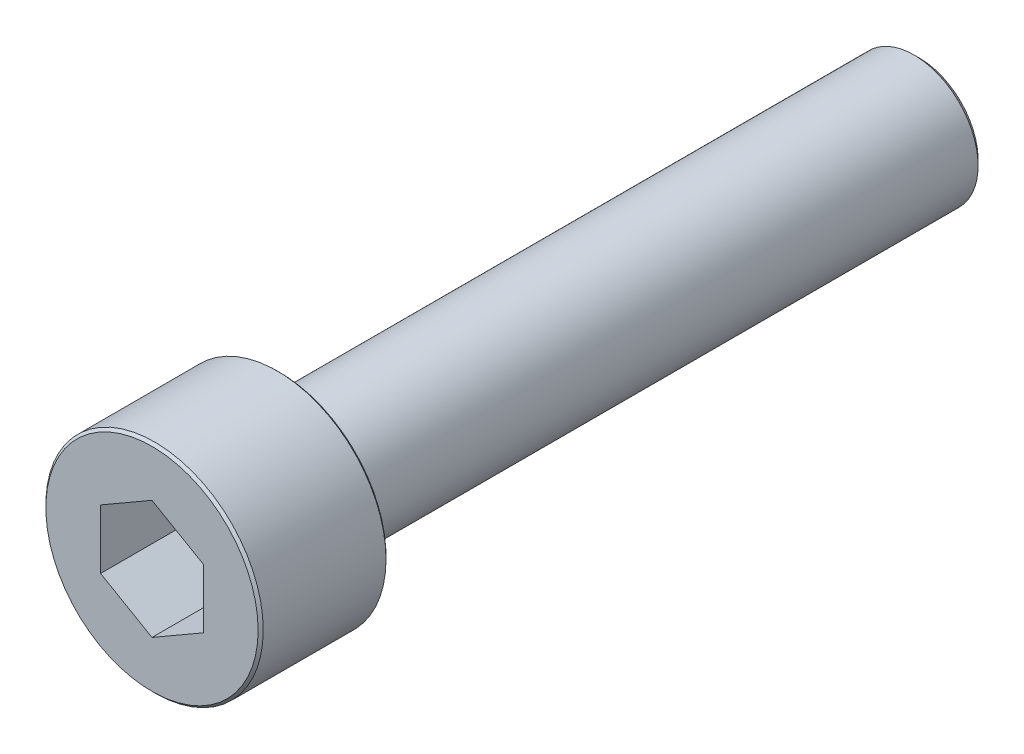
ISO-10303-21;
HEADER;
FILE_DESCRIPTION(('STEP AP214'),'2;1');
FILE_NAME('part.step','',(''),(''),'','','');
FILE_SCHEMA(('AUTOMOTIVE_DESIGN { 1 0 10303 214 1 1 1 1 }'));
ENDSEC;
DATA;
#1=APPLICATION_CONTEXT('core data for automotive mechanical design processes');
#2=APPLICATION_PROTOCOL_DEFINITION('international standard','automotive_design',2000,#1);
#3=PRODUCT_CONTEXT('',#1,'mechanical');
#4=PRODUCT('Part','Part','',(#3));
#5=PRODUCT_RELATED_PRODUCT_CATEGORY('part','',(#4));
#6=PRODUCT_DEFINITION_FORMATION('','',#4);
#7=PRODUCT_DEFINITION_CONTEXT('part definition',#1,'design');
#8=PRODUCT_DEFINITION('design','',#6,#7);
#9=PRODUCT_DEFINITION_SHAPE('','',#8);
#10=(LENGTH_UNIT() NAMED_UNIT(*) SI_UNIT(.MILLI.,.METRE.));
#11=(NAMED_UNIT(*) PLANE_ANGLE_UNIT() SI_UNIT($,.RADIAN.));
#12=(NAMED_UNIT(*) SI_UNIT($,.STERADIAN.) SOLID_ANGLE_UNIT());
#13=UNCERTAINTY_MEASURE_WITH_UNIT(LENGTH_MEASURE(1.E-05),#10,'distance_accuracy_value','');
#14=(GEOMETRIC_REPRESENTATION_CONTEXT(3) GLOBAL_UNCERTAINTY_ASSIGNED_CONTEXT((#13)) GLOBAL_UNIT_ASSIGNED_CONTEXT((#10,
#11,#12)) REPRESENTATION_CONTEXT('',''));
#15=CARTESIAN_POINT('',(0.,0.,0.));
#16=DIRECTION('',(0.,0.,1.));
#17=DIRECTION('',(1.,0.,0.));
#18=AXIS2_PLACEMENT_3D('',#15,#16,#17);
#19=CARTESIAN_POINT('',(0.,0.,25.));
#20=DIRECTION('',(0.,0.,1.));
#21=DIRECTION('',(1.,0.,0.));
#22=AXIS2_PLACEMENT_3D('',#19,#20,#21);
#23=CYLINDRICAL_SURFACE('',#22,4.25);
#24=CARTESIAN_POINT('',(0.,0.,25.1000020559313));
#25=DIRECTION('',(0.,0.,-1.));
#26=DIRECTION('',(-1.,0.,0.));
#27=AXIS2_PLACEMENT_3D('',#24,#25,#26);
#28=CIRCLE('',#27,4.25);
#29=CARTESIAN_POINT('',(-4.25,0.,25.1000020559313));
#30=VERTEX_POINT('',#29);
#31=EDGE_CURVE('E155',#30,#30,#28,.F.);
#32=ORIENTED_EDGE('',*,*,#31,.T.);
#33=EDGE_LOOP('',(#32));
#34=FACE_BOUND('',#33,.T.);
#35=CARTESIAN_POINT('',(0.,0.,29.8999978935918));
#36=DIRECTION('',(0.,0.,1.));
#37=DIRECTION('',(1.,0.,0.));
#38=AXIS2_PLACEMENT_3D('',#35,#36,#37);
#39=CIRCLE('',#38,4.25);
#40=CARTESIAN_POINT('',(4.25,0.,29.8999978935918));
#41=VERTEX_POINT('',#40);
#42=EDGE_CURVE('E152',#41,#41,#39,.F.);
#43=ORIENTED_EDGE('',*,*,#42,.T.);
#44=EDGE_LOOP('',(#43));
#45=FACE_BOUND('',#44,.T.);
#46=ADVANCED_FACE('F41',(#34,#45),#23,.T.);
#47=CARTESIAN_POINT('',(4.25,0.,25.));
#48=DIRECTION('',(0.,0.,-1.));
#49=DIRECTION('',(-1.,0.,0.));
#50=AXIS2_PLACEMENT_3D('',#47,#48,#49);
#51=PLANE('',#50);
#52=CARTESIAN_POINT('',(0.,0.,25.));
#53=DIRECTION('',(0.,0.,-1.));
#54=DIRECTION('',(-1.,0.,0.));
#55=AXIS2_PLACEMENT_3D('',#52,#53,#54);
#56=CIRCLE('',#55,4.14999789359176);
#57=CARTESIAN_POINT('',(-4.14999789359176,0.,25.));
#58=VERTEX_POINT('',#57);
#59=EDGE_CURVE('E158',#58,#58,#56,.T.);
#60=ORIENTED_EDGE('',*,*,#59,.T.);
#61=EDGE_LOOP('',(#60));
#62=FACE_BOUND('',#61,.T.);
#63=CARTESIAN_POINT('',(0.,0.,25.));
#64=DIRECTION('',(0.,0.,-1.));
#65=DIRECTION('',(-1.,0.,0.));
#66=AXIS2_PLACEMENT_3D('',#63,#64,#65);
#67=CIRCLE('',#66,2.5);
#68=CARTESIAN_POINT('',(-2.5,0.,25.));
#69=VERTEX_POINT('',#68);
#70=EDGE_CURVE('E144',#69,#69,#67,.T.);
#71=ORIENTED_EDGE('',*,*,#70,.F.);
#72=EDGE_LOOP('',(#71));
#73=FACE_BOUND('',#72,.T.);
#74=ADVANCED_FACE('F178',(#62,#73),#51,.T.);
#75=CARTESIAN_POINT('',(0.,0.,30.));
#76=DIRECTION('',(0.,0.,1.));
#77=DIRECTION('',(1.,0.,0.));
#78=AXIS2_PLACEMENT_3D('',#75,#76,#77);
#79=PLANE('',#78);
#80=CARTESIAN_POINT('',(0.,0.,30.));
#81=DIRECTION('',(0.,0.,1.));
#82=DIRECTION('',(1.,0.,0.));
#83=AXIS2_PLACEMENT_3D('',#80,#81,#82);
#84=CIRCLE('',#83,4.14999794406872);
#85=CARTESIAN_POINT('',(4.14999794406872,0.,30.));
#86=VERTEX_POINT('',#85);
#87=EDGE_CURVE('E161',#86,#86,#84,.T.);
#88=ORIENTED_EDGE('',*,*,#87,.T.);
#89=EDGE_LOOP('',(#88));
#90=FACE_BOUND('',#89,.T.);
#91=DIRECTION('',(0.,-1.,0.));
#92=VECTOR('',#91,1.);
#93=CARTESIAN_POINT('',(-2.00999999999998,1.16047404107096,30.));
#94=LINE('',#93,#92);
#95=CARTESIAN_POINT('',(-2.00999999999998,1.16047404107096,30.));
#96=VERTEX_POINT('',#95);
#97=CARTESIAN_POINT('',(-2.01,-1.160474041071,30.));
#98=VERTEX_POINT('',#97);
#99=EDGE_CURVE('E57',#96,#98,#94,.T.);
#100=ORIENTED_EDGE('',*,*,#99,.F.);
#101=DIRECTION('',(-0.866025403784436,-0.500000000000004,0.));
#102=VECTOR('',#101,1.);
#103=CARTESIAN_POINT('',(0.,2.32094808214212,30.));
#104=LINE('',#103,#102);
#105=CARTESIAN_POINT('',(0.,2.32094808214212,30.));
#106=VERTEX_POINT('',#105);
#107=EDGE_CURVE('E140',#106,#96,#104,.T.);
#108=ORIENTED_EDGE('',*,*,#107,.F.);
#109=DIRECTION('',(-0.866025403784428,0.500000000000018,0.));
#110=VECTOR('',#109,1.);
#111=CARTESIAN_POINT('',(2.0099999999999,1.16047404107098,30.));
#112=LINE('',#111,#110);
#113=CARTESIAN_POINT('',(2.0099999999999,1.16047404107098,30.));
#114=VERTEX_POINT('',#113);
#115=EDGE_CURVE('E138',#114,#106,#112,.T.);
#116=ORIENTED_EDGE('',*,*,#115,.F.);
#117=DIRECTION('',(0.,1.,0.));
#118=VECTOR('',#117,1.);
#119=CARTESIAN_POINT('',(2.0099999999999,-1.16047404107098,30.));
#120=LINE('',#119,#118);
#121=CARTESIAN_POINT('',(2.0099999999999,-1.16047404107098,30.));
#122=VERTEX_POINT('',#121);
#123=EDGE_CURVE('E105',#122,#114,#120,.T.);
#124=ORIENTED_EDGE('',*,*,#123,.F.);
#125=DIRECTION('',(0.866025403784439,0.5,0.));
#126=VECTOR('',#125,1.);
#127=CARTESIAN_POINT('',(0.,-2.32094808214211,30.));
#128=LINE('',#127,#126);
#129=CARTESIAN_POINT('',(0.,-2.32094808214211,30.));
#130=VERTEX_POINT('',#129);
#131=EDGE_CURVE('E134',#130,#122,#128,.T.);
#132=ORIENTED_EDGE('',*,*,#131,.F.);
#133=DIRECTION('',(0.866025403784439,-0.5,0.));
#134=VECTOR('',#133,1.);
#135=CARTESIAN_POINT('',(-2.01,-1.160474041071,30.));
#136=LINE('',#135,#134);
#137=EDGE_CURVE('E131',#98,#130,#136,.T.);
#138=ORIENTED_EDGE('',*,*,#137,.F.);
#139=EDGE_LOOP('',(#100,#108,#116,#124,#132,#138));
#140=FACE_BOUND('',#139,.T.);
#141=ADVANCED_FACE('F184',(#90,#140),#79,.T.);
#142=CARTESIAN_POINT('',(0.,0.,0.));
#143=DIRECTION('',(0.,0.,1.));
#144=DIRECTION('',(1.,0.,0.));
#145=AXIS2_PLACEMENT_3D('',#142,#143,#144);
#146=CYLINDRICAL_SURFACE('',#145,2.5);
#147=CARTESIAN_POINT('',(0.,0.,0.200036688697941));
#148=DIRECTION('',(0.,0.,-1.));
#149=DIRECTION('',(-1.,0.,0.));
#150=AXIS2_PLACEMENT_3D('',#147,#148,#149);
#151=CIRCLE('',#150,2.5);
#152=CARTESIAN_POINT('',(-2.5,0.,0.200036688697941));
#153=VERTEX_POINT('',#152);
#154=EDGE_CURVE('E11',#153,#153,#151,.F.);
#155=ORIENTED_EDGE('',*,*,#154,.T.);
#156=EDGE_LOOP('',(#155));
#157=FACE_BOUND('',#156,.T.);
#158=ORIENTED_EDGE('',*,*,#70,.T.);
#159=EDGE_LOOP('',(#158));
#160=FACE_BOUND('',#159,.T.);
#161=ADVANCED_FACE('F211',(#157,#160),#146,.T.);
#162=CARTESIAN_POINT('',(0.,0.,0.));
#163=DIRECTION('',(0.,0.,-1.));
#164=DIRECTION('',(-1.,0.,0.));
#165=AXIS2_PLACEMENT_3D('',#162,#163,#164);
#166=PLANE('',#165);
#167=CARTESIAN_POINT('',(0.,0.,0.));
#168=DIRECTION('',(0.,0.,-1.));
#169=DIRECTION('',(-1.,0.,0.));
#170=AXIS2_PLACEMENT_3D('',#167,#168,#169);
#171=CIRCLE('',#170,2.29996624687549);
#172=CARTESIAN_POINT('',(-2.29996624687549,0.,0.));
#173=VERTEX_POINT('',#172);
#174=EDGE_CURVE('E50',#173,#173,#171,.T.);
#175=ORIENTED_EDGE('',*,*,#174,.T.);
#176=EDGE_LOOP('',(#175));
#177=FACE_BOUND('',#176,.T.);
#178=ADVANCED_FACE('F166',(#177),#166,.T.);
#179=CARTESIAN_POINT('',(-2.00999999999998,1.16047404107096,26.25));
#180=DIRECTION('',(-1.,0.,0.));
#181=DIRECTION('',(0.,-1.,0.));
#182=AXIS2_PLACEMENT_3D('',#179,#180,#181);
#183=PLANE('',#182);
#184=ORIENTED_EDGE('',*,*,#99,.T.);
#185=DIRECTION('',(0.,0.,1.));
#186=VECTOR('',#185,1.);
#187=CARTESIAN_POINT('',(-2.01,-1.160474041071,26.25));
#188=LINE('',#187,#186);
#189=CARTESIAN_POINT('',(-2.01,-1.160474041071,26.25));
#190=VERTEX_POINT('',#189);
#191=EDGE_CURVE('E87',#190,#98,#188,.T.);
#192=ORIENTED_EDGE('',*,*,#191,.F.);
#193=DIRECTION('',(0.,-1.,0.));
#194=VECTOR('',#193,1.);
#195=CARTESIAN_POINT('',(-2.00999999999998,1.16047404107096,26.25));
#196=LINE('',#195,#194);
#197=CARTESIAN_POINT('',(-2.00999999999998,1.16047404107096,26.25));
#198=VERTEX_POINT('',#197);
#199=EDGE_CURVE('E142',#198,#190,#196,.T.);
#200=ORIENTED_EDGE('',*,*,#199,.F.);
#201=DIRECTION('',(0.,0.,1.));
#202=VECTOR('',#201,1.);
#203=CARTESIAN_POINT('',(-2.00999999999998,1.16047404107096,26.25));
#204=LINE('',#203,#202);
#205=EDGE_CURVE('E65',#198,#96,#204,.T.);
#206=ORIENTED_EDGE('',*,*,#205,.T.);
#207=EDGE_LOOP('',(#184,#192,#200,#206));
#208=FACE_BOUND('',#207,.T.);
#209=ADVANCED_FACE('F219',(#208),#183,.F.);
#210=CARTESIAN_POINT('',(0.,2.32094808214212,26.25));
#211=DIRECTION('',(-0.500000000000004,0.866025403784436,0.));
#212=DIRECTION('',(-0.866025403784436,-0.500000000000004,0.));
#213=AXIS2_PLACEMENT_3D('',#210,#211,#212);
#214=PLANE('',#213);
#215=ORIENTED_EDGE('',*,*,#107,.T.);
#216=ORIENTED_EDGE('',*,*,#205,.F.);
#217=DIRECTION('',(-0.866025403784436,-0.500000000000004,0.));
#218=VECTOR('',#217,1.);
#219=CARTESIAN_POINT('',(0.,2.32094808214212,26.25));
#220=LINE('',#219,#218);
#221=CARTESIAN_POINT('',(0.,2.32094808214212,26.25));
#222=VERTEX_POINT('',#221);
#223=EDGE_CURVE('E117',#222,#198,#220,.T.);
#224=ORIENTED_EDGE('',*,*,#223,.F.);
#225=DIRECTION('',(0.,0.,1.));
#226=VECTOR('',#225,1.);
#227=CARTESIAN_POINT('',(0.,2.32094808214212,26.25));
#228=LINE('',#227,#226);
#229=EDGE_CURVE('E109',#222,#106,#228,.T.);
#230=ORIENTED_EDGE('',*,*,#229,.T.);
#231=EDGE_LOOP('',(#215,#216,#224,#230));
#232=FACE_BOUND('',#231,.T.);
#233=ADVANCED_FACE('F225',(#232),#214,.F.);
#234=CARTESIAN_POINT('',(2.0099999999999,1.16047404107098,26.25));
#235=DIRECTION('',(0.500000000000018,0.866025403784428,0.));
#236=DIRECTION('',(-0.866025403784428,0.500000000000018,0.));
#237=AXIS2_PLACEMENT_3D('',#234,#235,#236);
#238=PLANE('',#237);
#239=ORIENTED_EDGE('',*,*,#115,.T.);
#240=ORIENTED_EDGE('',*,*,#229,.F.);
#241=DIRECTION('',(-0.866025403784428,0.500000000000018,0.));
#242=VECTOR('',#241,1.);
#243=CARTESIAN_POINT('',(2.0099999999999,1.16047404107098,26.25));
#244=LINE('',#243,#242);
#245=CARTESIAN_POINT('',(2.0099999999999,1.16047404107098,26.25));
#246=VERTEX_POINT('',#245);
#247=EDGE_CURVE('E113',#246,#222,#244,.T.);
#248=ORIENTED_EDGE('',*,*,#247,.F.);
#249=DIRECTION('',(0.,0.,1.));
#250=VECTOR('',#249,1.);
#251=CARTESIAN_POINT('',(2.0099999999999,1.16047404107098,26.25));
#252=LINE('',#251,#250);
#253=EDGE_CURVE('E98',#246,#114,#252,.T.);
#254=ORIENTED_EDGE('',*,*,#253,.T.);
#255=EDGE_LOOP('',(#239,#240,#248,#254));
#256=FACE_BOUND('',#255,.T.);
#257=ADVANCED_FACE('F114',(#256),#238,.F.);
#258=CARTESIAN_POINT('',(2.0099999999999,-1.16047404107098,26.25));
#259=DIRECTION('',(1.,0.,0.));
#260=DIRECTION('',(0.,0.,-1.));
#261=AXIS2_PLACEMENT_3D('',#258,#259,#260);
#262=PLANE('',#261);
#263=ORIENTED_EDGE('',*,*,#123,.T.);
#264=ORIENTED_EDGE('',*,*,#253,.F.);
#265=DIRECTION('',(0.,1.,0.));
#266=VECTOR('',#265,1.);
#267=CARTESIAN_POINT('',(2.0099999999999,-1.16047404107098,26.25));
#268=LINE('',#267,#266);
#269=CARTESIAN_POINT('',(2.0099999999999,-1.16047404107098,26.25));
#270=VERTEX_POINT('',#269);
#271=EDGE_CURVE('E102',#270,#246,#268,.T.);
#272=ORIENTED_EDGE('',*,*,#271,.F.);
#273=DIRECTION('',(0.,0.,1.));
#274=VECTOR('',#273,1.);
#275=CARTESIAN_POINT('',(2.0099999999999,-1.16047404107098,26.25));
#276=LINE('',#275,#274);
#277=EDGE_CURVE('E110',#270,#122,#276,.T.);
#278=ORIENTED_EDGE('',*,*,#277,.T.);
#279=EDGE_LOOP('',(#263,#264,#272,#278));
#280=FACE_BOUND('',#279,.T.);
#281=ADVANCED_FACE('F100',(#280),#262,.F.);
#282=CARTESIAN_POINT('',(0.,-2.32094808214211,26.25));
#283=DIRECTION('',(0.5,-0.866025403784438,0.));
#284=DIRECTION('',(0.866025403784439,0.5,0.));
#285=AXIS2_PLACEMENT_3D('',#282,#283,#284);
#286=PLANE('',#285);
#287=ORIENTED_EDGE('',*,*,#131,.T.);
#288=ORIENTED_EDGE('',*,*,#277,.F.);
#289=DIRECTION('',(0.866025403784439,0.5,0.));
#290=VECTOR('',#289,1.);
#291=CARTESIAN_POINT('',(0.,-2.32094808214211,26.25));
#292=LINE('',#291,#290);
#293=CARTESIAN_POINT('',(0.,-2.32094808214211,26.25));
#294=VERTEX_POINT('',#293);
#295=EDGE_CURVE('E123',#294,#270,#292,.T.);
#296=ORIENTED_EDGE('',*,*,#295,.F.);
#297=DIRECTION('',(0.,0.,1.));
#298=VECTOR('',#297,1.);
#299=CARTESIAN_POINT('',(0.,-2.32094808214211,26.25));
#300=LINE('',#299,#298);
#301=EDGE_CURVE('E147',#294,#130,#300,.T.);
#302=ORIENTED_EDGE('',*,*,#301,.T.);
#303=EDGE_LOOP('',(#287,#288,#296,#302));
#304=FACE_BOUND('',#303,.T.);
#305=ADVANCED_FACE('F228',(#304),#286,.F.);
#306=CARTESIAN_POINT('',(-2.01,-1.160474041071,26.25));
#307=DIRECTION('',(-0.5,-0.866025403784439,0.));
#308=DIRECTION('',(0.866025403784439,-0.5,0.));
#309=AXIS2_PLACEMENT_3D('',#306,#307,#308);
#310=PLANE('',#309);
#311=ORIENTED_EDGE('',*,*,#137,.T.);
#312=ORIENTED_EDGE('',*,*,#301,.F.);
#313=DIRECTION('',(0.866025403784439,-0.5,0.));
#314=VECTOR('',#313,1.);
#315=CARTESIAN_POINT('',(-2.01,-1.160474041071,26.25));
#316=LINE('',#315,#314);
#317=EDGE_CURVE('E125',#190,#294,#316,.T.);
#318=ORIENTED_EDGE('',*,*,#317,.F.);
#319=ORIENTED_EDGE('',*,*,#191,.T.);
#320=EDGE_LOOP('',(#311,#312,#318,#319));
#321=FACE_BOUND('',#320,.T.);
#322=ADVANCED_FACE('F203',(#321),#310,.F.);
#323=CARTESIAN_POINT('',(0.,0.,26.25));
#324=DIRECTION('',(0.,0.,1.));
#325=DIRECTION('',(1.,0.,0.));
#326=AXIS2_PLACEMENT_3D('',#323,#324,#325);
#327=PLANE('',#326);
#328=ORIENTED_EDGE('',*,*,#199,.T.);
#329=ORIENTED_EDGE('',*,*,#317,.T.);
#330=ORIENTED_EDGE('',*,*,#295,.T.);
#331=ORIENTED_EDGE('',*,*,#271,.T.);
#332=ORIENTED_EDGE('',*,*,#247,.T.);
#333=ORIENTED_EDGE('',*,*,#223,.T.);
#334=EDGE_LOOP('',(#328,#329,#330,#331,#332,#333));
#335=FACE_BOUND('',#334,.T.);
#336=ADVANCED_FACE('F120',(#335),#327,.T.);
#337=CARTESIAN_POINT('',(0.,0.,25.1000020559313));
#338=DIRECTION('',(0.,0.,1.));
#339=DIRECTION('',(1.,0.,0.));
#340=AXIS2_PLACEMENT_3D('',#337,#338,#339);
#341=CONICAL_SURFACE('',#340,4.25,0.785398415776976);
#342=ORIENTED_EDGE('',*,*,#59,.F.);
#343=EDGE_LOOP('',(#342));
#344=FACE_BOUND('',#343,.T.);
#345=ORIENTED_EDGE('',*,*,#31,.F.);
#346=EDGE_LOOP('',(#345));
#347=FACE_BOUND('',#346,.T.);
#348=ADVANCED_FACE('F174',(#344,#347),#341,.T.);
#349=CARTESIAN_POINT('',(0.,0.,30.));
#350=DIRECTION('',(0.,0.,-1.));
#351=DIRECTION('',(-1.,0.,0.));
#352=AXIS2_PLACEMENT_3D('',#349,#350,#351);
#353=CONICAL_SURFACE('',#352,4.14999794406872,0.785397911017886);
#354=ORIENTED_EDGE('',*,*,#42,.F.);
#355=EDGE_LOOP('',(#354));
#356=FACE_BOUND('',#355,.T.);
#357=ORIENTED_EDGE('',*,*,#87,.F.);
#358=EDGE_LOOP('',(#357));
#359=FACE_BOUND('',#358,.T.);
#360=ADVANCED_FACE('F169',(#356,#359),#353,.T.);
#361=CARTESIAN_POINT('',(0.,0.,0.));
#362=DIRECTION('',(0.,0.,1.));
#363=DIRECTION('',(1.,0.,0.));
#364=AXIS2_PLACEMENT_3D('',#361,#362,#363);
#365=CONICAL_SURFACE('',#364,2.29996624687549,0.785390825756065);
#366=ORIENTED_EDGE('',*,*,#154,.F.);
#367=EDGE_LOOP('',(#366));
#368=FACE_BOUND('',#367,.T.);
#369=ORIENTED_EDGE('',*,*,#174,.F.);
#370=EDGE_LOOP('',(#369));
#371=FACE_BOUND('',#370,.T.);
#372=ADVANCED_FACE('F44',(#368,#371),#365,.T.);
#373=CLOSED_SHELL('',(#46,#74,#141,#161,#178,#209,#233,#257,#281,#305,#322,#336,#348,#360,#372));
#374=MANIFOLD_SOLID_BREP('B2',#373);
#375=ADVANCED_BREP_SHAPE_REPRESENTATION('',(#18,#374),#14);
#376=SHAPE_DEFINITION_REPRESENTATION(#9,#375);
ENDSEC;
END-ISO-10303-21;
